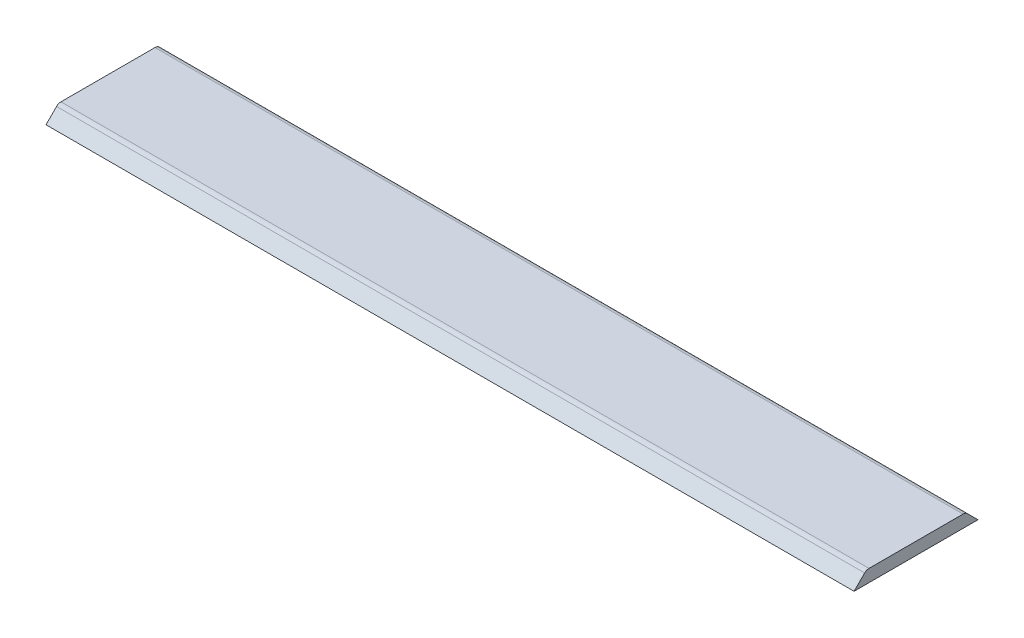
ISO-10303-21;
HEADER;
FILE_DESCRIPTION(('STEP AP214'),'2;1');
FILE_NAME('part.step','',(''),(''),'','','');
FILE_SCHEMA(('AUTOMOTIVE_DESIGN { 1 0 10303 214 1 1 1 1 }'));
ENDSEC;
DATA;
#1=APPLICATION_CONTEXT('core data for automotive mechanical design processes');
#2=APPLICATION_PROTOCOL_DEFINITION('international standard','automotive_design',2000,#1);
#3=PRODUCT_CONTEXT('',#1,'mechanical');
#4=PRODUCT('Part','Part','',(#3));
#5=PRODUCT_RELATED_PRODUCT_CATEGORY('part','',(#4));
#6=PRODUCT_DEFINITION_FORMATION('','',#4);
#7=PRODUCT_DEFINITION_CONTEXT('part definition',#1,'design');
#8=PRODUCT_DEFINITION('design','',#6,#7);
#9=PRODUCT_DEFINITION_SHAPE('','',#8);
#10=(LENGTH_UNIT() NAMED_UNIT(*) SI_UNIT(.MILLI.,.METRE.));
#11=(NAMED_UNIT(*) PLANE_ANGLE_UNIT() SI_UNIT($,.RADIAN.));
#12=(NAMED_UNIT(*) SI_UNIT($,.STERADIAN.) SOLID_ANGLE_UNIT());
#13=UNCERTAINTY_MEASURE_WITH_UNIT(LENGTH_MEASURE(1.E-05),#10,'distance_accuracy_value','');
#14=(GEOMETRIC_REPRESENTATION_CONTEXT(3) GLOBAL_UNCERTAINTY_ASSIGNED_CONTEXT((#13)) GLOBAL_UNIT_ASSIGNED_CONTEXT((#10,
#11,#12)) REPRESENTATION_CONTEXT('',''));
#15=CARTESIAN_POINT('',(0.,0.,0.));
#16=DIRECTION('',(0.,0.,1.));
#17=DIRECTION('',(1.,0.,0.));
#18=AXIS2_PLACEMENT_3D('',#15,#16,#17);
#19=CARTESIAN_POINT('',(32600.,0.,0.));
#20=DIRECTION('',(0.,-0.707106781186548,-0.707106781186548));
#21=DIRECTION('',(0.,0.707106781186548,-0.707106781186547));
#22=AXIS2_PLACEMENT_3D('',#19,#20,#21);
#23=PLANE('',#22);
#24=DIRECTION('',(0.,-0.707106781186548,0.707106781186547));
#25=VECTOR('',#24,1.);
#26=CARTESIAN_POINT('',(32600.,0.,0.));
#27=LINE('',#26,#25);
#28=CARTESIAN_POINT('',(32600.,426.776695296637,-426.776695296637));
#29=VERTEX_POINT('',#28);
#30=CARTESIAN_POINT('',(32600.,0.,0.));
#31=VERTEX_POINT('',#30);
#32=EDGE_CURVE('E87',#29,#31,#27,.T.);
#33=ORIENTED_EDGE('',*,*,#32,.F.);
#34=DIRECTION('',(-1.,0.,0.));
#35=VECTOR('',#34,1.);
#36=CARTESIAN_POINT('',(32600.,426.776695296637,-426.776695296637));
#37=LINE('',#36,#35);
#38=CARTESIAN_POINT('',(0.,426.776695296637,-426.776695296637));
#39=VERTEX_POINT('',#38);
#40=EDGE_CURVE('E11',#29,#39,#37,.T.);
#41=ORIENTED_EDGE('',*,*,#40,.T.);
#42=DIRECTION('',(0.,-0.707106781186548,0.707106781186547));
#43=VECTOR('',#42,1.);
#44=CARTESIAN_POINT('',(0.,0.,0.));
#45=LINE('',#44,#43);
#46=CARTESIAN_POINT('',(0.,0.,0.));
#47=VERTEX_POINT('',#46);
#48=EDGE_CURVE('E106',#39,#47,#45,.T.);
#49=ORIENTED_EDGE('',*,*,#48,.T.);
#50=DIRECTION('',(-1.,0.,0.));
#51=VECTOR('',#50,1.);
#52=CARTESIAN_POINT('',(32600.,0.,0.));
#53=LINE('',#52,#51);
#54=EDGE_CURVE('E100',#31,#47,#53,.T.);
#55=ORIENTED_EDGE('',*,*,#54,.F.);
#56=EDGE_LOOP('',(#33,#41,#49,#55));
#57=FACE_BOUND('',#56,.T.);
#58=ADVANCED_FACE('F34',(#57),#23,.F.);
#59=CARTESIAN_POINT('',(32600.,0.,0.));
#60=DIRECTION('',(0.,1.,0.));
#61=DIRECTION('',(0.,0.,1.));
#62=AXIS2_PLACEMENT_3D('',#59,#60,#61);
#63=PLANE('',#62);
#64=DIRECTION('',(0.,0.,-1.));
#65=VECTOR('',#64,1.);
#66=CARTESIAN_POINT('',(0.,0.,0.));
#67=LINE('',#66,#65);
#68=CARTESIAN_POINT('',(0.,0.,-5000.));
#69=VERTEX_POINT('',#68);
#70=EDGE_CURVE('E139',#47,#69,#67,.T.);
#71=ORIENTED_EDGE('',*,*,#70,.T.);
#72=DIRECTION('',(-1.,0.,0.));
#73=VECTOR('',#72,1.);
#74=CARTESIAN_POINT('',(32600.,0.,-5000.));
#75=LINE('',#74,#73);
#76=CARTESIAN_POINT('',(32600.,0.,-5000.));
#77=VERTEX_POINT('',#76);
#78=EDGE_CURVE('E102',#77,#69,#75,.T.);
#79=ORIENTED_EDGE('',*,*,#78,.F.);
#80=DIRECTION('',(0.,0.,-1.));
#81=VECTOR('',#80,1.);
#82=CARTESIAN_POINT('',(32600.,0.,0.));
#83=LINE('',#82,#81);
#84=EDGE_CURVE('E90',#31,#77,#83,.T.);
#85=ORIENTED_EDGE('',*,*,#84,.F.);
#86=ORIENTED_EDGE('',*,*,#54,.T.);
#87=EDGE_LOOP('',(#71,#79,#85,#86));
#88=FACE_BOUND('',#87,.T.);
#89=ADVANCED_FACE('F99',(#88),#63,.F.);
#90=CARTESIAN_POINT('',(32600.,0.,-5000.));
#91=DIRECTION('',(0.,-0.707106781186548,0.707106781186548));
#92=DIRECTION('',(0.,-0.707106781186548,-0.707106781186548));
#93=AXIS2_PLACEMENT_3D('',#90,#91,#92);
#94=PLANE('',#93);
#95=DIRECTION('',(0.,0.707106781186547,0.707106781186547));
#96=VECTOR('',#95,1.);
#97=CARTESIAN_POINT('',(0.,0.,-5000.));
#98=LINE('',#97,#96);
#99=CARTESIAN_POINT('',(0.,426.776695296637,-4573.22330470336));
#100=VERTEX_POINT('',#99);
#101=EDGE_CURVE('E137',#69,#100,#98,.T.);
#102=ORIENTED_EDGE('',*,*,#101,.T.);
#103=DIRECTION('',(-1.,0.,0.));
#104=VECTOR('',#103,1.);
#105=CARTESIAN_POINT('',(32600.,426.776695296637,-4573.22330470336));
#106=LINE('',#105,#104);
#107=CARTESIAN_POINT('',(32600.,426.776695296637,-4573.22330470336));
#108=VERTEX_POINT('',#107);
#109=EDGE_CURVE('E57',#100,#108,#106,.F.);
#110=ORIENTED_EDGE('',*,*,#109,.T.);
#111=DIRECTION('',(0.,0.707106781186547,0.707106781186547));
#112=VECTOR('',#111,1.);
#113=CARTESIAN_POINT('',(32600.,0.,-5000.));
#114=LINE('',#113,#112);
#115=EDGE_CURVE('E103',#77,#108,#114,.T.);
#116=ORIENTED_EDGE('',*,*,#115,.F.);
#117=ORIENTED_EDGE('',*,*,#78,.T.);
#118=EDGE_LOOP('',(#102,#110,#116,#117));
#119=FACE_BOUND('',#118,.T.);
#120=ADVANCED_FACE('F138',(#119),#94,.F.);
#121=CARTESIAN_POINT('',(32600.,500.,-500.));
#122=DIRECTION('',(0.,-1.,0.));
#123=DIRECTION('',(0.,0.,-1.));
#124=AXIS2_PLACEMENT_3D('',#121,#122,#123);
#125=PLANE('',#124);
#126=DIRECTION('',(0.,0.,1.));
#127=VECTOR('',#126,1.);
#128=CARTESIAN_POINT('',(32600.,500.,-500.));
#129=LINE('',#128,#127);
#130=CARTESIAN_POINT('',(32600.,500.,-4396.44660940673));
#131=VERTEX_POINT('',#130);
#132=CARTESIAN_POINT('',(32600.,500.,-603.553390593274));
#133=VERTEX_POINT('',#132);
#134=EDGE_CURVE('E112',#131,#133,#129,.T.);
#135=ORIENTED_EDGE('',*,*,#134,.F.);
#136=DIRECTION('',(-1.,0.,0.));
#137=VECTOR('',#136,1.);
#138=CARTESIAN_POINT('',(32600.,500.,-4396.44660940673));
#139=LINE('',#138,#137);
#140=CARTESIAN_POINT('',(0.,500.,-4396.44660940673));
#141=VERTEX_POINT('',#140);
#142=EDGE_CURVE('E110',#131,#141,#139,.T.);
#143=ORIENTED_EDGE('',*,*,#142,.T.);
#144=DIRECTION('',(0.,0.,1.));
#145=VECTOR('',#144,1.);
#146=CARTESIAN_POINT('',(0.,500.,-500.));
#147=LINE('',#146,#145);
#148=CARTESIAN_POINT('',(0.,500.,-603.553390593274));
#149=VERTEX_POINT('',#148);
#150=EDGE_CURVE('E95',#141,#149,#147,.T.);
#151=ORIENTED_EDGE('',*,*,#150,.T.);
#152=DIRECTION('',(-1.,0.,0.));
#153=VECTOR('',#152,1.);
#154=CARTESIAN_POINT('',(32600.,500.,-603.553390593274));
#155=LINE('',#154,#153);
#156=EDGE_CURVE('E108',#149,#133,#155,.F.);
#157=ORIENTED_EDGE('',*,*,#156,.T.);
#158=EDGE_LOOP('',(#135,#143,#151,#157));
#159=FACE_BOUND('',#158,.T.);
#160=ADVANCED_FACE('F128',(#159),#125,.F.);
#161=CARTESIAN_POINT('',(32600.,0.,0.));
#162=DIRECTION('',(1.,0.,0.));
#163=DIRECTION('',(0.,0.,-1.));
#164=AXIS2_PLACEMENT_3D('',#161,#162,#163);
#165=PLANE('',#164);
#166=ORIENTED_EDGE('',*,*,#115,.T.);
#167=CARTESIAN_POINT('',(32600.,250.,-4396.44660940673));
#168=DIRECTION('',(1.,0.,0.));
#169=DIRECTION('',(0.,0.,-1.));
#170=AXIS2_PLACEMENT_3D('',#167,#168,#169);
#171=CIRCLE('',#170,250.);
#172=EDGE_CURVE('E42',#108,#131,#171,.T.);
#173=ORIENTED_EDGE('',*,*,#172,.T.);
#174=ORIENTED_EDGE('',*,*,#134,.T.);
#175=CARTESIAN_POINT('',(32600.,250.,-603.553390593274));
#176=DIRECTION('',(1.,0.,0.));
#177=DIRECTION('',(0.,0.,-1.));
#178=AXIS2_PLACEMENT_3D('',#175,#176,#177);
#179=CIRCLE('',#178,250.);
#180=EDGE_CURVE('E49',#133,#29,#179,.T.);
#181=ORIENTED_EDGE('',*,*,#180,.T.);
#182=ORIENTED_EDGE('',*,*,#32,.T.);
#183=ORIENTED_EDGE('',*,*,#84,.T.);
#184=EDGE_LOOP('',(#166,#173,#174,#181,#182,#183));
#185=FACE_BOUND('',#184,.T.);
#186=ADVANCED_FACE('F89',(#185),#165,.T.);
#187=CARTESIAN_POINT('',(0.,0.,0.));
#188=DIRECTION('',(1.,0.,0.));
#189=DIRECTION('',(0.,0.,-1.));
#190=AXIS2_PLACEMENT_3D('',#187,#188,#189);
#191=PLANE('',#190);
#192=ORIENTED_EDGE('',*,*,#150,.F.);
#193=CARTESIAN_POINT('',(0.,250.,-4396.44660940673));
#194=DIRECTION('',(1.,0.,0.));
#195=DIRECTION('',(0.,0.,-1.));
#196=AXIS2_PLACEMENT_3D('',#193,#194,#195);
#197=CIRCLE('',#196,250.);
#198=EDGE_CURVE('E120',#141,#100,#197,.F.);
#199=ORIENTED_EDGE('',*,*,#198,.T.);
#200=ORIENTED_EDGE('',*,*,#101,.F.);
#201=ORIENTED_EDGE('',*,*,#70,.F.);
#202=ORIENTED_EDGE('',*,*,#48,.F.);
#203=CARTESIAN_POINT('',(0.,250.,-603.553390593274));
#204=DIRECTION('',(1.,0.,0.));
#205=DIRECTION('',(0.,0.,-1.));
#206=AXIS2_PLACEMENT_3D('',#203,#204,#205);
#207=CIRCLE('',#206,250.);
#208=EDGE_CURVE('E118',#39,#149,#207,.F.);
#209=ORIENTED_EDGE('',*,*,#208,.T.);
#210=EDGE_LOOP('',(#192,#199,#200,#201,#202,#209));
#211=FACE_BOUND('',#210,.T.);
#212=ADVANCED_FACE('F136',(#211),#191,.F.);
#213=CARTESIAN_POINT('',(32600.,250.,-4396.44660940673));
#214=DIRECTION('',(-1.,0.,0.));
#215=DIRECTION('',(0.,0.,1.));
#216=AXIS2_PLACEMENT_3D('',#213,#214,#215);
#217=CYLINDRICAL_SURFACE('',#216,250.);
#218=ORIENTED_EDGE('',*,*,#172,.F.);
#219=ORIENTED_EDGE('',*,*,#109,.F.);
#220=ORIENTED_EDGE('',*,*,#198,.F.);
#221=ORIENTED_EDGE('',*,*,#142,.F.);
#222=EDGE_LOOP('',(#218,#219,#220,#221));
#223=FACE_BOUND('',#222,.T.);
#224=ADVANCED_FACE('F133',(#223),#217,.T.);
#225=CARTESIAN_POINT('',(32600.,250.,-603.553390593274));
#226=DIRECTION('',(-1.,0.,0.));
#227=DIRECTION('',(0.,0.,1.));
#228=AXIS2_PLACEMENT_3D('',#225,#226,#227);
#229=CYLINDRICAL_SURFACE('',#228,250.);
#230=ORIENTED_EDGE('',*,*,#180,.F.);
#231=ORIENTED_EDGE('',*,*,#156,.F.);
#232=ORIENTED_EDGE('',*,*,#208,.F.);
#233=ORIENTED_EDGE('',*,*,#40,.F.);
#234=EDGE_LOOP('',(#230,#231,#232,#233));
#235=FACE_BOUND('',#234,.T.);
#236=ADVANCED_FACE('F36',(#235),#229,.T.);
#237=CLOSED_SHELL('',(#58,#89,#120,#160,#186,#212,#224,#236));
#238=MANIFOLD_SOLID_BREP('B2',#237);
#239=ADVANCED_BREP_SHAPE_REPRESENTATION('',(#18,#238),#14);
#240=SHAPE_DEFINITION_REPRESENTATION(#9,#239);
ENDSEC;
END-ISO-10303-21;
